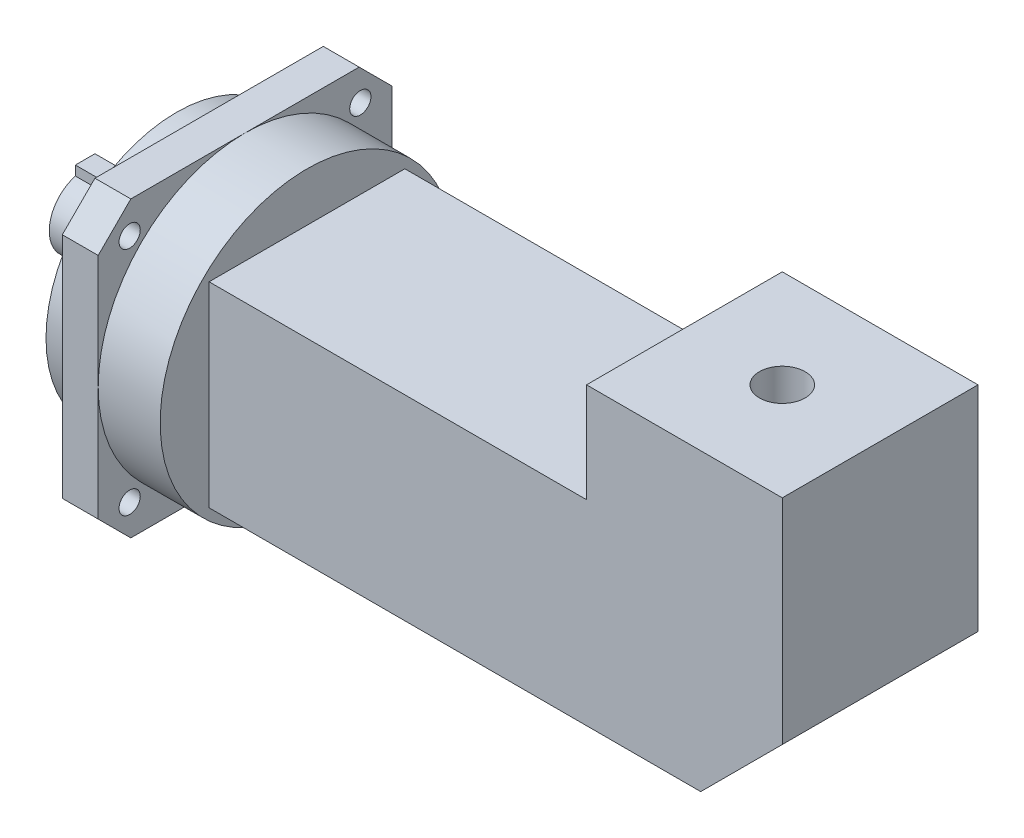
ISO-10303-21;
HEADER;
FILE_DESCRIPTION(('STEP AP214'),'2;1');
FILE_NAME('part.step','',(''),(''),'','','');
FILE_SCHEMA(('AUTOMOTIVE_DESIGN { 1 0 10303 214 1 1 1 1 }'));
ENDSEC;
DATA;
#1=APPLICATION_CONTEXT('core data for automotive mechanical design processes');
#2=APPLICATION_PROTOCOL_DEFINITION('international standard','automotive_design',2000,#1);
#3=PRODUCT_CONTEXT('',#1,'mechanical');
#4=PRODUCT('Part','Part','',(#3));
#5=PRODUCT_RELATED_PRODUCT_CATEGORY('part','',(#4));
#6=PRODUCT_DEFINITION_FORMATION('','',#4);
#7=PRODUCT_DEFINITION_CONTEXT('part definition',#1,'design');
#8=PRODUCT_DEFINITION('design','',#6,#7);
#9=PRODUCT_DEFINITION_SHAPE('','',#8);
#10=(LENGTH_UNIT() NAMED_UNIT(*) SI_UNIT(.MILLI.,.METRE.));
#11=(NAMED_UNIT(*) PLANE_ANGLE_UNIT() SI_UNIT($,.RADIAN.));
#12=(NAMED_UNIT(*) SI_UNIT($,.STERADIAN.) SOLID_ANGLE_UNIT());
#13=UNCERTAINTY_MEASURE_WITH_UNIT(LENGTH_MEASURE(1.E-05),#10,'distance_accuracy_value','');
#14=(GEOMETRIC_REPRESENTATION_CONTEXT(3) GLOBAL_UNCERTAINTY_ASSIGNED_CONTEXT((#13)) GLOBAL_UNIT_ASSIGNED_CONTEXT((#10,
#11,#12)) REPRESENTATION_CONTEXT('',''));
#15=CARTESIAN_POINT('',(0.,0.,0.));
#16=DIRECTION('',(0.,0.,1.));
#17=DIRECTION('',(1.,0.,0.));
#18=AXIS2_PLACEMENT_3D('',#15,#16,#17);
#19=CARTESIAN_POINT('',(30.,0.,0.));
#20=DIRECTION('',(1.,0.,0.));
#21=DIRECTION('',(0.,0.,-1.));
#22=AXIS2_PLACEMENT_3D('',#19,#20,#21);
#23=PLANE('',#22);
#24=CARTESIAN_POINT('',(30.,0.,0.));
#25=DIRECTION('',(1.,0.,0.));
#26=DIRECTION('',(0.,0.,-1.));
#27=AXIS2_PLACEMENT_3D('',#24,#25,#26);
#28=CIRCLE('',#27,45.);
#29=CARTESIAN_POINT('',(30.,0.,-45.));
#30=VERTEX_POINT('',#29);
#31=EDGE_CURVE('E359',#30,#30,#28,.T.);
#32=ORIENTED_EDGE('',*,*,#31,.T.);
#33=EDGE_LOOP('',(#32));
#34=FACE_BOUND('',#33,.T.);
#35=DIRECTION('',(0.,0.,1.));
#36=VECTOR('',#35,1.);
#37=CARTESIAN_POINT('',(30.,30.,30.));
#38=LINE('',#37,#36);
#39=CARTESIAN_POINT('',(30.,30.,-30.));
#40=VERTEX_POINT('',#39);
#41=CARTESIAN_POINT('',(30.,30.,30.));
#42=VERTEX_POINT('',#41);
#43=EDGE_CURVE('E347',#40,#42,#38,.T.);
#44=ORIENTED_EDGE('',*,*,#43,.F.);
#45=DIRECTION('',(0.,1.,0.));
#46=VECTOR('',#45,1.);
#47=CARTESIAN_POINT('',(30.,30.,-30.));
#48=LINE('',#47,#46);
#49=CARTESIAN_POINT('',(30.,-30.,-30.));
#50=VERTEX_POINT('',#49);
#51=EDGE_CURVE('E343',#50,#40,#48,.T.);
#52=ORIENTED_EDGE('',*,*,#51,.F.);
#53=DIRECTION('',(0.,0.,-1.));
#54=VECTOR('',#53,1.);
#55=CARTESIAN_POINT('',(30.,-30.,30.));
#56=LINE('',#55,#54);
#57=CARTESIAN_POINT('',(30.,-30.,30.));
#58=VERTEX_POINT('',#57);
#59=EDGE_CURVE('E355',#58,#50,#56,.T.);
#60=ORIENTED_EDGE('',*,*,#59,.F.);
#61=DIRECTION('',(0.,-1.,0.));
#62=VECTOR('',#61,1.);
#63=CARTESIAN_POINT('',(30.,30.,30.));
#64=LINE('',#63,#62);
#65=EDGE_CURVE('E351',#42,#58,#64,.T.);
#66=ORIENTED_EDGE('',*,*,#65,.F.);
#67=EDGE_LOOP('',(#44,#52,#60,#66));
#68=FACE_BOUND('',#67,.T.);
#69=ADVANCED_FACE('F43',(#34,#68),#23,.T.);
#70=CARTESIAN_POINT('',(30.,0.,0.));
#71=DIRECTION('',(-1.,0.,0.));
#72=DIRECTION('',(0.,0.,1.));
#73=AXIS2_PLACEMENT_3D('',#70,#71,#72);
#74=CYLINDRICAL_SURFACE('',#73,45.);
#75=CARTESIAN_POINT('',(11.,0.,0.));
#76=DIRECTION('',(1.,0.,0.));
#77=DIRECTION('',(0.,0.,-1.));
#78=AXIS2_PLACEMENT_3D('',#75,#76,#77);
#79=CIRCLE('',#78,45.);
#80=CARTESIAN_POINT('',(11.,-45.,0.));
#81=VERTEX_POINT('',#80);
#82=CARTESIAN_POINT('',(11.,0.,-45.));
#83=VERTEX_POINT('',#82);
#84=EDGE_CURVE('E48',#81,#83,#79,.T.);
#85=ORIENTED_EDGE('',*,*,#84,.T.);
#86=CARTESIAN_POINT('',(11.,45.,0.));
#87=VERTEX_POINT('',#86);
#88=EDGE_CURVE('E11',#83,#87,#79,.T.);
#89=ORIENTED_EDGE('',*,*,#88,.T.);
#90=CARTESIAN_POINT('',(11.,0.,45.));
#91=VERTEX_POINT('',#90);
#92=EDGE_CURVE('E54',#87,#91,#79,.T.);
#93=ORIENTED_EDGE('',*,*,#92,.T.);
#94=EDGE_CURVE('E432',#91,#81,#79,.T.);
#95=ORIENTED_EDGE('',*,*,#94,.T.);
#96=EDGE_LOOP('',(#85,#89,#93,#95));
#97=FACE_BOUND('',#96,.T.);
#98=ORIENTED_EDGE('',*,*,#31,.F.);
#99=EDGE_LOOP('',(#98));
#100=FACE_BOUND('',#99,.T.);
#101=ADVANCED_FACE('F437',(#97,#100),#74,.T.);
#102=CARTESIAN_POINT('',(205.7,0.,-30.));
#103=DIRECTION('',(0.,0.,-1.));
#104=DIRECTION('',(0.,1.,0.));
#105=AXIS2_PLACEMENT_3D('',#102,#103,#104);
#106=PLANE('',#105);
#107=DIRECTION('',(0.,-1.,0.));
#108=VECTOR('',#107,1.);
#109=CARTESIAN_POINT('',(205.7,0.,-30.));
#110=LINE('',#109,#108);
#111=CARTESIAN_POINT('',(205.7,60.5,-30.));
#112=VERTEX_POINT('',#111);
#113=CARTESIAN_POINT('',(205.7,-5.00000000000004,-30.));
#114=VERTEX_POINT('',#113);
#115=EDGE_CURVE('E323',#112,#114,#110,.T.);
#116=ORIENTED_EDGE('',*,*,#115,.T.);
#117=DIRECTION('',(-0.707106781186549,-0.707106781186546,0.));
#118=VECTOR('',#117,1.);
#119=CARTESIAN_POINT('',(208.2,-2.50000000000003,-30.));
#120=LINE('',#119,#118);
#121=CARTESIAN_POINT('',(180.7,-30.,-30.));
#122=VERTEX_POINT('',#121);
#123=EDGE_CURVE('E422',#114,#122,#120,.T.);
#124=ORIENTED_EDGE('',*,*,#123,.T.);
#125=DIRECTION('',(-1.,0.,0.));
#126=VECTOR('',#125,1.);
#127=CARTESIAN_POINT('',(205.7,-30.,-30.));
#128=LINE('',#127,#126);
#129=EDGE_CURVE('E331',#122,#50,#128,.T.);
#130=ORIENTED_EDGE('',*,*,#129,.T.);
#131=ORIENTED_EDGE('',*,*,#51,.T.);
#132=DIRECTION('',(-1.,0.,0.));
#133=VECTOR('',#132,1.);
#134=CARTESIAN_POINT('',(205.7,30.,-30.));
#135=LINE('',#134,#133);
#136=CARTESIAN_POINT('',(145.7,30.,-30.));
#137=VERTEX_POINT('',#136);
#138=EDGE_CURVE('E340',#137,#40,#135,.T.);
#139=ORIENTED_EDGE('',*,*,#138,.F.);
#140=DIRECTION('',(0.,-1.,0.));
#141=VECTOR('',#140,1.);
#142=CARTESIAN_POINT('',(145.7,60.5,-30.));
#143=LINE('',#142,#141);
#144=CARTESIAN_POINT('',(145.7,60.5,-30.));
#145=VERTEX_POINT('',#144);
#146=EDGE_CURVE('E316',#145,#137,#143,.T.);
#147=ORIENTED_EDGE('',*,*,#146,.F.);
#148=DIRECTION('',(-1.,0.,0.));
#149=VECTOR('',#148,1.);
#150=CARTESIAN_POINT('',(145.7,60.5,-30.));
#151=LINE('',#150,#149);
#152=EDGE_CURVE('E303',#112,#145,#151,.T.);
#153=ORIENTED_EDGE('',*,*,#152,.F.);
#154=EDGE_LOOP('',(#116,#124,#130,#131,#139,#147,#153));
#155=FACE_BOUND('',#154,.T.);
#156=ADVANCED_FACE('F499',(#155),#106,.T.);
#157=CARTESIAN_POINT('',(205.7,30.,0.));
#158=DIRECTION('',(0.,1.,0.));
#159=DIRECTION('',(0.,0.,1.));
#160=AXIS2_PLACEMENT_3D('',#157,#158,#159);
#161=PLANE('',#160);
#162=DIRECTION('',(-1.,0.,0.));
#163=VECTOR('',#162,1.);
#164=CARTESIAN_POINT('',(205.7,30.,30.));
#165=LINE('',#164,#163);
#166=CARTESIAN_POINT('',(145.7,30.,30.));
#167=VERTEX_POINT('',#166);
#168=EDGE_CURVE('E337',#167,#42,#165,.T.);
#169=ORIENTED_EDGE('',*,*,#168,.F.);
#170=DIRECTION('',(0.,0.,-1.));
#171=VECTOR('',#170,1.);
#172=CARTESIAN_POINT('',(145.7,30.,0.));
#173=LINE('',#172,#171);
#174=EDGE_CURVE('E319',#167,#137,#173,.T.);
#175=ORIENTED_EDGE('',*,*,#174,.T.);
#176=ORIENTED_EDGE('',*,*,#138,.T.);
#177=ORIENTED_EDGE('',*,*,#43,.T.);
#178=EDGE_LOOP('',(#169,#175,#176,#177));
#179=FACE_BOUND('',#178,.T.);
#180=ADVANCED_FACE('F784',(#179),#161,.T.);
#181=CARTESIAN_POINT('',(205.7,0.,30.));
#182=DIRECTION('',(0.,0.,-1.));
#183=DIRECTION('',(0.,1.,0.));
#184=AXIS2_PLACEMENT_3D('',#181,#182,#183);
#185=PLANE('',#184);
#186=DIRECTION('',(-1.,0.,0.));
#187=VECTOR('',#186,1.);
#188=CARTESIAN_POINT('',(205.7,-30.,30.));
#189=LINE('',#188,#187);
#190=CARTESIAN_POINT('',(180.7,-30.,30.));
#191=VERTEX_POINT('',#190);
#192=EDGE_CURVE('E334',#191,#58,#189,.T.);
#193=ORIENTED_EDGE('',*,*,#192,.F.);
#194=DIRECTION('',(0.707106781186549,0.707106781186546,0.));
#195=VECTOR('',#194,1.);
#196=CARTESIAN_POINT('',(205.7,-5.00000000000004,30.));
#197=LINE('',#196,#195);
#198=CARTESIAN_POINT('',(205.7,-5.00000000000004,30.));
#199=VERTEX_POINT('',#198);
#200=EDGE_CURVE('E426',#191,#199,#197,.T.);
#201=ORIENTED_EDGE('',*,*,#200,.T.);
#202=DIRECTION('',(0.,-1.,0.));
#203=VECTOR('',#202,1.);
#204=CARTESIAN_POINT('',(205.7,0.,30.));
#205=LINE('',#204,#203);
#206=CARTESIAN_POINT('',(205.7,60.5,30.));
#207=VERTEX_POINT('',#206);
#208=EDGE_CURVE('E327',#207,#199,#205,.T.);
#209=ORIENTED_EDGE('',*,*,#208,.F.);
#210=DIRECTION('',(1.,0.,0.));
#211=VECTOR('',#210,1.);
#212=CARTESIAN_POINT('',(145.7,60.5,30.));
#213=LINE('',#212,#211);
#214=CARTESIAN_POINT('',(145.7,60.5,30.));
#215=VERTEX_POINT('',#214);
#216=EDGE_CURVE('E309',#215,#207,#213,.T.);
#217=ORIENTED_EDGE('',*,*,#216,.F.);
#218=DIRECTION('',(0.,-1.,0.));
#219=VECTOR('',#218,1.);
#220=CARTESIAN_POINT('',(145.7,60.5,30.));
#221=LINE('',#220,#219);
#222=EDGE_CURVE('E313',#215,#167,#221,.T.);
#223=ORIENTED_EDGE('',*,*,#222,.T.);
#224=ORIENTED_EDGE('',*,*,#168,.T.);
#225=ORIENTED_EDGE('',*,*,#65,.T.);
#226=EDGE_LOOP('',(#193,#201,#209,#217,#223,#224,#225));
#227=FACE_BOUND('',#226,.T.);
#228=ADVANCED_FACE('F775',(#227),#185,.F.);
#229=CARTESIAN_POINT('',(205.7,-30.,0.));
#230=DIRECTION('',(0.,1.,0.));
#231=DIRECTION('',(0.,0.,1.));
#232=AXIS2_PLACEMENT_3D('',#229,#230,#231);
#233=PLANE('',#232);
#234=ORIENTED_EDGE('',*,*,#129,.F.);
#235=DIRECTION('',(0.,0.,1.));
#236=VECTOR('',#235,1.);
#237=CARTESIAN_POINT('',(180.7,-30.,30.));
#238=LINE('',#237,#236);
#239=EDGE_CURVE('E69',#122,#191,#238,.T.);
#240=ORIENTED_EDGE('',*,*,#239,.T.);
#241=ORIENTED_EDGE('',*,*,#192,.T.);
#242=ORIENTED_EDGE('',*,*,#59,.T.);
#243=EDGE_LOOP('',(#234,#240,#241,#242));
#244=FACE_BOUND('',#243,.T.);
#245=ADVANCED_FACE('F761',(#244),#233,.F.);
#246=CARTESIAN_POINT('',(205.7,0.,0.));
#247=DIRECTION('',(1.,0.,0.));
#248=DIRECTION('',(0.,0.,-1.));
#249=AXIS2_PLACEMENT_3D('',#246,#247,#248);
#250=PLANE('',#249);
#251=ORIENTED_EDGE('',*,*,#208,.T.);
#252=DIRECTION('',(0.,0.,-1.));
#253=VECTOR('',#252,1.);
#254=CARTESIAN_POINT('',(205.7,-5.00000000000004,-30.));
#255=LINE('',#254,#253);
#256=EDGE_CURVE('E418',#199,#114,#255,.T.);
#257=ORIENTED_EDGE('',*,*,#256,.T.);
#258=ORIENTED_EDGE('',*,*,#115,.F.);
#259=DIRECTION('',(0.,0.,-1.));
#260=VECTOR('',#259,1.);
#261=CARTESIAN_POINT('',(205.7,60.5,-30.));
#262=LINE('',#261,#260);
#263=EDGE_CURVE('E299',#207,#112,#262,.T.);
#264=ORIENTED_EDGE('',*,*,#263,.F.);
#265=EDGE_LOOP('',(#251,#257,#258,#264));
#266=FACE_BOUND('',#265,.T.);
#267=ADVANCED_FACE('F755',(#266),#250,.T.);
#268=CARTESIAN_POINT('',(0.,60.5,0.));
#269=DIRECTION('',(0.,1.,0.));
#270=DIRECTION('',(0.,0.,1.));
#271=AXIS2_PLACEMENT_3D('',#268,#269,#270);
#272=PLANE('',#271);
#273=ORIENTED_EDGE('',*,*,#263,.T.);
#274=ORIENTED_EDGE('',*,*,#152,.T.);
#275=DIRECTION('',(0.,0.,1.));
#276=VECTOR('',#275,1.);
#277=CARTESIAN_POINT('',(145.7,60.5,-30.));
#278=LINE('',#277,#276);
#279=EDGE_CURVE('E306',#145,#215,#278,.T.);
#280=ORIENTED_EDGE('',*,*,#279,.T.);
#281=ORIENTED_EDGE('',*,*,#216,.T.);
#282=EDGE_LOOP('',(#273,#274,#280,#281));
#283=FACE_BOUND('',#282,.T.);
#284=CARTESIAN_POINT('',(175.7,60.5,0.));
#285=DIRECTION('',(0.,1.,0.));
#286=DIRECTION('',(0.,0.,1.));
#287=AXIS2_PLACEMENT_3D('',#284,#285,#286);
#288=CIRCLE('',#287,7.00000000000001);
#289=CARTESIAN_POINT('',(175.7,60.5,7.));
#290=VERTEX_POINT('',#289);
#291=EDGE_CURVE('E201',#290,#290,#288,.T.);
#292=ORIENTED_EDGE('',*,*,#291,.F.);
#293=EDGE_LOOP('',(#292));
#294=FACE_BOUND('',#293,.T.);
#295=ADVANCED_FACE('F760',(#283,#294),#272,.T.);
#296=CARTESIAN_POINT('',(145.7,60.5,-30.));
#297=DIRECTION('',(1.,0.,0.));
#298=DIRECTION('',(0.,0.,-1.));
#299=AXIS2_PLACEMENT_3D('',#296,#297,#298);
#300=PLANE('',#299);
#301=ORIENTED_EDGE('',*,*,#174,.F.);
#302=ORIENTED_EDGE('',*,*,#222,.F.);
#303=ORIENTED_EDGE('',*,*,#279,.F.);
#304=ORIENTED_EDGE('',*,*,#146,.T.);
#305=EDGE_LOOP('',(#301,#302,#303,#304));
#306=FACE_BOUND('',#305,.T.);
#307=ADVANCED_FACE('F808',(#306),#300,.F.);
#308=CARTESIAN_POINT('',(175.7,60.5,0.));
#309=DIRECTION('',(0.,-1.,0.));
#310=DIRECTION('',(0.,0.,-1.));
#311=AXIS2_PLACEMENT_3D('',#308,#309,#310);
#312=CYLINDRICAL_SURFACE('',#311,7.00000000000001);
#313=CARTESIAN_POINT('',(175.7,30.,0.));
#314=DIRECTION('',(0.,1.,0.));
#315=DIRECTION('',(0.,0.,1.));
#316=AXIS2_PLACEMENT_3D('',#313,#314,#315);
#317=CIRCLE('',#316,7.00000000000001);
#318=CARTESIAN_POINT('',(175.7,30.,7.));
#319=VERTEX_POINT('',#318);
#320=EDGE_CURVE('E414',#319,#319,#317,.F.);
#321=ORIENTED_EDGE('',*,*,#320,.T.);
#322=EDGE_LOOP('',(#321));
#323=FACE_BOUND('',#322,.T.);
#324=ORIENTED_EDGE('',*,*,#291,.T.);
#325=EDGE_LOOP('',(#324));
#326=FACE_BOUND('',#325,.T.);
#327=ADVANCED_FACE('F800',(#323,#326),#312,.F.);
#328=ORIENTED_EDGE('',*,*,#320,.F.);
#329=EDGE_LOOP('',(#328));
#330=FACE_BOUND('',#329,.T.);
#331=ADVANCED_FACE('F748',(#330),#161,.T.);
#332=CARTESIAN_POINT('',(205.7,-5.00000000000004,0.));
#333=DIRECTION('',(0.707106781186546,-0.707106781186549,0.));
#334=DIRECTION('',(0.,0.,1.));
#335=AXIS2_PLACEMENT_3D('',#332,#333,#334);
#336=PLANE('',#335);
#337=ORIENTED_EDGE('',*,*,#200,.F.);
#338=ORIENTED_EDGE('',*,*,#239,.F.);
#339=ORIENTED_EDGE('',*,*,#123,.F.);
#340=ORIENTED_EDGE('',*,*,#256,.F.);
#341=EDGE_LOOP('',(#337,#338,#339,#340));
#342=FACE_BOUND('',#341,.T.);
#343=ADVANCED_FACE('F46',(#342),#336,.T.);
#344=CARTESIAN_POINT('',(11.,45.,0.));
#345=DIRECTION('',(0.,1.,0.));
#346=DIRECTION('',(0.,0.,1.));
#347=AXIS2_PLACEMENT_3D('',#344,#345,#346);
#348=PLANE('',#347);
#349=DIRECTION('',(0.,0.,-1.));
#350=VECTOR('',#349,1.);
#351=CARTESIAN_POINT('',(0.,45.,0.));
#352=LINE('',#351,#350);
#353=CARTESIAN_POINT('',(0.,45.,35.));
#354=VERTEX_POINT('',#353);
#355=CARTESIAN_POINT('',(0.,45.,-35.));
#356=VERTEX_POINT('',#355);
#357=EDGE_CURVE('E195',#354,#356,#352,.T.);
#358=ORIENTED_EDGE('',*,*,#357,.F.);
#359=DIRECTION('',(-1.,0.,0.));
#360=VECTOR('',#359,1.);
#361=CARTESIAN_POINT('',(11.,45.,35.));
#362=LINE('',#361,#360);
#363=CARTESIAN_POINT('',(11.,45.,35.));
#364=VERTEX_POINT('',#363);
#365=EDGE_CURVE('E190',#364,#354,#362,.T.);
#366=ORIENTED_EDGE('',*,*,#365,.F.);
#367=DIRECTION('',(0.,0.,-1.));
#368=VECTOR('',#367,1.);
#369=CARTESIAN_POINT('',(11.,45.,0.));
#370=LINE('',#369,#368);
#371=EDGE_CURVE('E193',#364,#87,#370,.T.);
#372=ORIENTED_EDGE('',*,*,#371,.T.);
#373=CARTESIAN_POINT('',(11.,45.,-35.));
#374=VERTEX_POINT('',#373);
#375=EDGE_CURVE('E212',#87,#374,#370,.T.);
#376=ORIENTED_EDGE('',*,*,#375,.T.);
#377=DIRECTION('',(-1.,0.,0.));
#378=VECTOR('',#377,1.);
#379=CARTESIAN_POINT('',(11.,45.,-35.));
#380=LINE('',#379,#378);
#381=EDGE_CURVE('E245',#374,#356,#380,.T.);
#382=ORIENTED_EDGE('',*,*,#381,.T.);
#383=EDGE_LOOP('',(#358,#366,#372,#376,#382));
#384=FACE_BOUND('',#383,.T.);
#385=ADVANCED_FACE('F192',(#384),#348,.T.);
#386=CARTESIAN_POINT('',(11.,0.,45.));
#387=DIRECTION('',(0.,0.,-1.));
#388=DIRECTION('',(0.,1.,0.));
#389=AXIS2_PLACEMENT_3D('',#386,#387,#388);
#390=PLANE('',#389);
#391=DIRECTION('',(0.,-1.,0.));
#392=VECTOR('',#391,1.);
#393=CARTESIAN_POINT('',(11.,0.,45.));
#394=LINE('',#393,#392);
#395=CARTESIAN_POINT('',(11.,-35.,45.));
#396=VERTEX_POINT('',#395);
#397=EDGE_CURVE('E218',#91,#396,#394,.T.);
#398=ORIENTED_EDGE('',*,*,#397,.F.);
#399=CARTESIAN_POINT('',(11.,35.,45.));
#400=VERTEX_POINT('',#399);
#401=EDGE_CURVE('E221',#400,#91,#394,.T.);
#402=ORIENTED_EDGE('',*,*,#401,.F.);
#403=DIRECTION('',(-1.,0.,0.));
#404=VECTOR('',#403,1.);
#405=CARTESIAN_POINT('',(11.,35.,45.));
#406=LINE('',#405,#404);
#407=CARTESIAN_POINT('',(0.,35.,45.));
#408=VERTEX_POINT('',#407);
#409=EDGE_CURVE('E202',#400,#408,#406,.T.);
#410=ORIENTED_EDGE('',*,*,#409,.T.);
#411=DIRECTION('',(0.,-1.,0.));
#412=VECTOR('',#411,1.);
#413=CARTESIAN_POINT('',(0.,0.,45.));
#414=LINE('',#413,#412);
#415=CARTESIAN_POINT('',(0.,-35.,45.));
#416=VERTEX_POINT('',#415);
#417=EDGE_CURVE('E252',#408,#416,#414,.T.);
#418=ORIENTED_EDGE('',*,*,#417,.T.);
#419=DIRECTION('',(-1.,0.,0.));
#420=VECTOR('',#419,1.);
#421=CARTESIAN_POINT('',(11.,-35.,45.));
#422=LINE('',#421,#420);
#423=EDGE_CURVE('E290',#396,#416,#422,.T.);
#424=ORIENTED_EDGE('',*,*,#423,.F.);
#425=EDGE_LOOP('',(#398,#402,#410,#418,#424));
#426=FACE_BOUND('',#425,.T.);
#427=ADVANCED_FACE('F556',(#426),#390,.F.);
#428=CARTESIAN_POINT('',(11.,-45.,0.));
#429=DIRECTION('',(0.,1.,0.));
#430=DIRECTION('',(0.,0.,1.));
#431=AXIS2_PLACEMENT_3D('',#428,#429,#430);
#432=PLANE('',#431);
#433=DIRECTION('',(0.,0.,-1.));
#434=VECTOR('',#433,1.);
#435=CARTESIAN_POINT('',(11.,-45.,0.));
#436=LINE('',#435,#434);
#437=CARTESIAN_POINT('',(11.,-45.,-35.));
#438=VERTEX_POINT('',#437);
#439=EDGE_CURVE('E229',#81,#438,#436,.T.);
#440=ORIENTED_EDGE('',*,*,#439,.F.);
#441=CARTESIAN_POINT('',(11.,-45.,35.));
#442=VERTEX_POINT('',#441);
#443=EDGE_CURVE('E230',#442,#81,#436,.T.);
#444=ORIENTED_EDGE('',*,*,#443,.F.);
#445=DIRECTION('',(-1.,0.,0.));
#446=VECTOR('',#445,1.);
#447=CARTESIAN_POINT('',(11.,-45.,35.));
#448=LINE('',#447,#446);
#449=CARTESIAN_POINT('',(0.,-45.,35.));
#450=VERTEX_POINT('',#449);
#451=EDGE_CURVE('E286',#442,#450,#448,.T.);
#452=ORIENTED_EDGE('',*,*,#451,.T.);
#453=DIRECTION('',(0.,0.,-1.));
#454=VECTOR('',#453,1.);
#455=CARTESIAN_POINT('',(0.,-45.,0.));
#456=LINE('',#455,#454);
#457=CARTESIAN_POINT('',(0.,-45.,-35.));
#458=VERTEX_POINT('',#457);
#459=EDGE_CURVE('E259',#450,#458,#456,.T.);
#460=ORIENTED_EDGE('',*,*,#459,.T.);
#461=DIRECTION('',(-1.,0.,0.));
#462=VECTOR('',#461,1.);
#463=CARTESIAN_POINT('',(11.,-45.,-35.));
#464=LINE('',#463,#462);
#465=EDGE_CURVE('E282',#438,#458,#464,.T.);
#466=ORIENTED_EDGE('',*,*,#465,.F.);
#467=EDGE_LOOP('',(#440,#444,#452,#460,#466));
#468=FACE_BOUND('',#467,.T.);
#469=ADVANCED_FACE('F564',(#468),#432,.F.);
#470=CARTESIAN_POINT('',(11.,0.,-45.));
#471=DIRECTION('',(0.,0.,-1.));
#472=DIRECTION('',(0.,1.,0.));
#473=AXIS2_PLACEMENT_3D('',#470,#471,#472);
#474=PLANE('',#473);
#475=DIRECTION('',(-1.,0.,0.));
#476=VECTOR('',#475,1.);
#477=CARTESIAN_POINT('',(11.,-35.,-45.));
#478=LINE('',#477,#476);
#479=CARTESIAN_POINT('',(11.,-35.,-45.));
#480=VERTEX_POINT('',#479);
#481=CARTESIAN_POINT('',(0.,-35.,-45.));
#482=VERTEX_POINT('',#481);
#483=EDGE_CURVE('E278',#480,#482,#478,.T.);
#484=ORIENTED_EDGE('',*,*,#483,.T.);
#485=DIRECTION('',(0.,-1.,0.));
#486=VECTOR('',#485,1.);
#487=CARTESIAN_POINT('',(0.,0.,-45.));
#488=LINE('',#487,#486);
#489=CARTESIAN_POINT('',(0.,35.,-45.));
#490=VERTEX_POINT('',#489);
#491=EDGE_CURVE('E266',#490,#482,#488,.T.);
#492=ORIENTED_EDGE('',*,*,#491,.F.);
#493=DIRECTION('',(-1.,0.,0.));
#494=VECTOR('',#493,1.);
#495=CARTESIAN_POINT('',(11.,35.,-45.));
#496=LINE('',#495,#494);
#497=CARTESIAN_POINT('',(11.,35.,-45.));
#498=VERTEX_POINT('',#497);
#499=EDGE_CURVE('E275',#498,#490,#496,.T.);
#500=ORIENTED_EDGE('',*,*,#499,.F.);
#501=DIRECTION('',(0.,-1.,0.));
#502=VECTOR('',#501,1.);
#503=CARTESIAN_POINT('',(11.,0.,-45.));
#504=LINE('',#503,#502);
#505=EDGE_CURVE('E61',#498,#83,#504,.T.);
#506=ORIENTED_EDGE('',*,*,#505,.T.);
#507=EDGE_CURVE('E238',#83,#480,#504,.T.);
#508=ORIENTED_EDGE('',*,*,#507,.T.);
#509=EDGE_LOOP('',(#484,#492,#500,#506,#508));
#510=FACE_BOUND('',#509,.T.);
#511=ADVANCED_FACE('F571',(#510),#474,.T.);
#512=CARTESIAN_POINT('',(11.,0.,0.));
#513=DIRECTION('',(1.,0.,0.));
#514=DIRECTION('',(0.,0.,-1.));
#515=AXIS2_PLACEMENT_3D('',#512,#513,#514);
#516=PLANE('',#515);
#517=CARTESIAN_POINT('',(11.,35.3553390593274,-35.3553390593273));
#518=DIRECTION('',(1.,0.,0.));
#519=DIRECTION('',(0.,0.,-1.));
#520=AXIS2_PLACEMENT_3D('',#517,#518,#519);
#521=CIRCLE('',#520,3.25);
#522=CARTESIAN_POINT('',(11.,35.3553390593274,-38.6053390593273));
#523=VERTEX_POINT('',#522);
#524=EDGE_CURVE('E455',#523,#523,#521,.F.);
#525=ORIENTED_EDGE('',*,*,#524,.T.);
#526=EDGE_LOOP('',(#525));
#527=FACE_BOUND('',#526,.T.);
#528=ORIENTED_EDGE('',*,*,#88,.F.);
#529=ORIENTED_EDGE('',*,*,#505,.F.);
#530=DIRECTION('',(0.,-0.707106781186547,-0.707106781186548));
#531=VECTOR('',#530,1.);
#532=CARTESIAN_POINT('',(11.,40.,-40.));
#533=LINE('',#532,#531);
#534=EDGE_CURVE('E241',#374,#498,#533,.T.);
#535=ORIENTED_EDGE('',*,*,#534,.F.);
#536=ORIENTED_EDGE('',*,*,#375,.F.);
#537=EDGE_LOOP('',(#528,#529,#535,#536));
#538=FACE_BOUND('',#537,.T.);
#539=ADVANCED_FACE('F441',(#527,#538),#516,.T.);
#540=CARTESIAN_POINT('',(11.,35.3553390593273,35.3553390593274));
#541=DIRECTION('',(1.,0.,0.));
#542=DIRECTION('',(0.,0.,-1.));
#543=AXIS2_PLACEMENT_3D('',#540,#541,#542);
#544=CIRCLE('',#543,3.25);
#545=CARTESIAN_POINT('',(11.,35.3553390593273,32.1053390593274));
#546=VERTEX_POINT('',#545);
#547=EDGE_CURVE('E249',#546,#546,#544,.F.);
#548=ORIENTED_EDGE('',*,*,#547,.T.);
#549=EDGE_LOOP('',(#548));
#550=FACE_BOUND('',#549,.T.);
#551=ORIENTED_EDGE('',*,*,#92,.F.);
#552=ORIENTED_EDGE('',*,*,#371,.F.);
#553=DIRECTION('',(0.,0.707106781186547,-0.707106781186548));
#554=VECTOR('',#553,1.);
#555=CARTESIAN_POINT('',(11.,40.,40.));
#556=LINE('',#555,#554);
#557=EDGE_CURVE('E208',#400,#364,#556,.T.);
#558=ORIENTED_EDGE('',*,*,#557,.F.);
#559=ORIENTED_EDGE('',*,*,#401,.T.);
#560=EDGE_LOOP('',(#551,#552,#558,#559));
#561=FACE_BOUND('',#560,.T.);
#562=ADVANCED_FACE('F206',(#550,#561),#516,.T.);
#563=CARTESIAN_POINT('',(11.,-35.3553390593274,35.3553390593273));
#564=DIRECTION('',(1.,0.,0.));
#565=DIRECTION('',(0.,0.,-1.));
#566=AXIS2_PLACEMENT_3D('',#563,#564,#565);
#567=CIRCLE('',#566,3.25);
#568=CARTESIAN_POINT('',(11.,-35.3553390593274,32.1053390593273));
#569=VERTEX_POINT('',#568);
#570=EDGE_CURVE('E448',#569,#569,#567,.F.);
#571=ORIENTED_EDGE('',*,*,#570,.T.);
#572=EDGE_LOOP('',(#571));
#573=FACE_BOUND('',#572,.T.);
#574=ORIENTED_EDGE('',*,*,#94,.F.);
#575=ORIENTED_EDGE('',*,*,#397,.T.);
#576=DIRECTION('',(0.,-0.707106781186548,-0.707106781186547));
#577=VECTOR('',#576,1.);
#578=CARTESIAN_POINT('',(11.,-40.,40.));
#579=LINE('',#578,#577);
#580=EDGE_CURVE('E226',#396,#442,#579,.T.);
#581=ORIENTED_EDGE('',*,*,#580,.T.);
#582=ORIENTED_EDGE('',*,*,#443,.T.);
#583=EDGE_LOOP('',(#574,#575,#581,#582));
#584=FACE_BOUND('',#583,.T.);
#585=ADVANCED_FACE('F559',(#573,#584),#516,.T.);
#586=CARTESIAN_POINT('',(11.,40.,40.));
#587=DIRECTION('',(0.,0.707106781186548,0.707106781186547));
#588=DIRECTION('',(0.,-0.707106781186547,0.707106781186548));
#589=AXIS2_PLACEMENT_3D('',#586,#587,#588);
#590=PLANE('',#589);
#591=DIRECTION('',(0.,0.707106781186547,-0.707106781186548));
#592=VECTOR('',#591,1.);
#593=CARTESIAN_POINT('',(0.,40.,40.));
#594=LINE('',#593,#592);
#595=EDGE_CURVE('E248',#408,#354,#594,.T.);
#596=ORIENTED_EDGE('',*,*,#595,.F.);
#597=ORIENTED_EDGE('',*,*,#409,.F.);
#598=ORIENTED_EDGE('',*,*,#557,.T.);
#599=ORIENTED_EDGE('',*,*,#365,.T.);
#600=EDGE_LOOP('',(#596,#597,#598,#599));
#601=FACE_BOUND('',#600,.T.);
#602=ADVANCED_FACE('F214',(#601),#590,.T.);
#603=CARTESIAN_POINT('',(11.,-40.,40.));
#604=DIRECTION('',(0.,0.707106781186547,-0.707106781186548));
#605=DIRECTION('',(0.,0.707106781186548,0.707106781186547));
#606=AXIS2_PLACEMENT_3D('',#603,#604,#605);
#607=PLANE('',#606);
#608=DIRECTION('',(0.,-0.707106781186548,-0.707106781186547));
#609=VECTOR('',#608,1.);
#610=CARTESIAN_POINT('',(0.,-40.,40.));
#611=LINE('',#610,#609);
#612=EDGE_CURVE('E255',#416,#450,#611,.T.);
#613=ORIENTED_EDGE('',*,*,#612,.T.);
#614=ORIENTED_EDGE('',*,*,#451,.F.);
#615=ORIENTED_EDGE('',*,*,#580,.F.);
#616=ORIENTED_EDGE('',*,*,#423,.T.);
#617=EDGE_LOOP('',(#613,#614,#615,#616));
#618=FACE_BOUND('',#617,.T.);
#619=ADVANCED_FACE('F593',(#618),#607,.F.);
#620=CARTESIAN_POINT('',(11.,-40.,-40.));
#621=DIRECTION('',(0.,-0.707106781186547,-0.707106781186548));
#622=DIRECTION('',(0.,0.707106781186548,-0.707106781186547));
#623=AXIS2_PLACEMENT_3D('',#620,#621,#622);
#624=PLANE('',#623);
#625=DIRECTION('',(0.,-0.707106781186548,0.707106781186547));
#626=VECTOR('',#625,1.);
#627=CARTESIAN_POINT('',(0.,-40.,-40.));
#628=LINE('',#627,#626);
#629=EDGE_CURVE('E262',#482,#458,#628,.T.);
#630=ORIENTED_EDGE('',*,*,#629,.F.);
#631=ORIENTED_EDGE('',*,*,#483,.F.);
#632=DIRECTION('',(0.,-0.707106781186548,0.707106781186547));
#633=VECTOR('',#632,1.);
#634=CARTESIAN_POINT('',(11.,-40.,-40.));
#635=LINE('',#634,#633);
#636=EDGE_CURVE('E234',#480,#438,#635,.T.);
#637=ORIENTED_EDGE('',*,*,#636,.T.);
#638=ORIENTED_EDGE('',*,*,#465,.T.);
#639=EDGE_LOOP('',(#630,#631,#637,#638));
#640=FACE_BOUND('',#639,.T.);
#641=ADVANCED_FACE('F575',(#640),#624,.T.);
#642=CARTESIAN_POINT('',(11.,40.,-40.));
#643=DIRECTION('',(0.,0.707106781186548,-0.707106781186547));
#644=DIRECTION('',(0.,0.707106781186547,0.707106781186548));
#645=AXIS2_PLACEMENT_3D('',#642,#643,#644);
#646=PLANE('',#645);
#647=DIRECTION('',(0.,-0.707106781186547,-0.707106781186548));
#648=VECTOR('',#647,1.);
#649=CARTESIAN_POINT('',(0.,40.,-40.));
#650=LINE('',#649,#648);
#651=EDGE_CURVE('E269',#356,#490,#650,.T.);
#652=ORIENTED_EDGE('',*,*,#651,.F.);
#653=ORIENTED_EDGE('',*,*,#381,.F.);
#654=ORIENTED_EDGE('',*,*,#534,.T.);
#655=ORIENTED_EDGE('',*,*,#499,.T.);
#656=EDGE_LOOP('',(#652,#653,#654,#655));
#657=FACE_BOUND('',#656,.T.);
#658=ADVANCED_FACE('F577',(#657),#646,.T.);
#659=CARTESIAN_POINT('',(11.,-35.3553390593273,-35.3553390593274));
#660=DIRECTION('',(1.,0.,0.));
#661=DIRECTION('',(0.,0.,-1.));
#662=AXIS2_PLACEMENT_3D('',#659,#660,#661);
#663=CIRCLE('',#662,3.25);
#664=CARTESIAN_POINT('',(11.,-35.3553390593273,-38.6053390593274));
#665=VERTEX_POINT('',#664);
#666=EDGE_CURVE('E451',#665,#665,#663,.F.);
#667=ORIENTED_EDGE('',*,*,#666,.T.);
#668=EDGE_LOOP('',(#667));
#669=FACE_BOUND('',#668,.T.);
#670=ORIENTED_EDGE('',*,*,#84,.F.);
#671=ORIENTED_EDGE('',*,*,#439,.T.);
#672=ORIENTED_EDGE('',*,*,#636,.F.);
#673=ORIENTED_EDGE('',*,*,#507,.F.);
#674=EDGE_LOOP('',(#670,#671,#672,#673));
#675=FACE_BOUND('',#674,.T.);
#676=ADVANCED_FACE('F521',(#669,#675),#516,.T.);
#677=CARTESIAN_POINT('',(-38.,0.,0.));
#678=DIRECTION('',(1.,0.,0.));
#679=DIRECTION('',(0.,0.,-1.));
#680=AXIS2_PLACEMENT_3D('',#677,#678,#679);
#681=PLANE('',#680);
#682=CARTESIAN_POINT('',(-38.,0.,0.));
#683=DIRECTION('',(1.,0.,0.));
#684=DIRECTION('',(0.,0.,-1.));
#685=AXIS2_PLACEMENT_3D('',#682,#683,#684);
#686=CIRCLE('',#685,11.);
#687=CARTESIAN_POINT('',(-38.,10.5830052442584,3.));
#688=VERTEX_POINT('',#687);
#689=CARTESIAN_POINT('',(-38.,10.5830052442584,-3.));
#690=VERTEX_POINT('',#689);
#691=EDGE_CURVE('E383',#688,#690,#686,.T.);
#692=ORIENTED_EDGE('',*,*,#691,.F.);
#693=DIRECTION('',(0.,-1.,0.));
#694=VECTOR('',#693,1.);
#695=CARTESIAN_POINT('',(-38.,0.,3.));
#696=LINE('',#695,#694);
#697=CARTESIAN_POINT('',(-38.,13.5,3.));
#698=VERTEX_POINT('',#697);
#699=EDGE_CURVE('E398',#698,#688,#696,.T.);
#700=ORIENTED_EDGE('',*,*,#699,.F.);
#701=DIRECTION('',(0.,0.,1.));
#702=VECTOR('',#701,1.);
#703=CARTESIAN_POINT('',(-38.,13.5,0.));
#704=LINE('',#703,#702);
#705=CARTESIAN_POINT('',(-38.,13.5,-3.));
#706=VERTEX_POINT('',#705);
#707=EDGE_CURVE('E394',#706,#698,#704,.T.);
#708=ORIENTED_EDGE('',*,*,#707,.F.);
#709=DIRECTION('',(0.,-1.,0.));
#710=VECTOR('',#709,1.);
#711=CARTESIAN_POINT('',(-38.,0.,-3.));
#712=LINE('',#711,#710);
#713=EDGE_CURVE('E390',#706,#690,#712,.T.);
#714=ORIENTED_EDGE('',*,*,#713,.T.);
#715=EDGE_LOOP('',(#692,#700,#708,#714));
#716=FACE_BOUND('',#715,.T.);
#717=ADVANCED_FACE('F517',(#716),#681,.F.);
#718=CARTESIAN_POINT('',(10.,0.,3.));
#719=DIRECTION('',(0.,0.,-1.));
#720=DIRECTION('',(-1.,0.,0.));
#721=AXIS2_PLACEMENT_3D('',#718,#719,#720);
#722=PLANE('',#721);
#723=DIRECTION('',(0.,-1.,0.));
#724=VECTOR('',#723,1.);
#725=CARTESIAN_POINT('',(-10.,0.,3.));
#726=LINE('',#725,#724);
#727=CARTESIAN_POINT('',(-10.,13.5,3.));
#728=VERTEX_POINT('',#727);
#729=CARTESIAN_POINT('',(-10.,10.5830052442584,3.));
#730=VERTEX_POINT('',#729);
#731=EDGE_CURVE('E368',#728,#730,#726,.T.);
#732=ORIENTED_EDGE('',*,*,#731,.F.);
#733=DIRECTION('',(-1.,0.,0.));
#734=VECTOR('',#733,1.);
#735=CARTESIAN_POINT('',(10.,13.5,3.));
#736=LINE('',#735,#734);
#737=EDGE_CURVE('E405',#728,#698,#736,.T.);
#738=ORIENTED_EDGE('',*,*,#737,.T.);
#739=ORIENTED_EDGE('',*,*,#699,.T.);
#740=DIRECTION('',(-1.,0.,0.));
#741=VECTOR('',#740,1.);
#742=CARTESIAN_POINT('',(10.,10.5830052442584,3.));
#743=LINE('',#742,#741);
#744=EDGE_CURVE('E402',#730,#688,#743,.T.);
#745=ORIENTED_EDGE('',*,*,#744,.F.);
#746=EDGE_LOOP('',(#732,#738,#739,#745));
#747=FACE_BOUND('',#746,.T.);
#748=ADVANCED_FACE('F520',(#747),#722,.F.);
#749=CARTESIAN_POINT('',(10.,13.5,0.));
#750=DIRECTION('',(0.,-1.,0.));
#751=DIRECTION('',(0.,0.,-1.));
#752=AXIS2_PLACEMENT_3D('',#749,#750,#751);
#753=PLANE('',#752);
#754=DIRECTION('',(0.,0.,1.));
#755=VECTOR('',#754,1.);
#756=CARTESIAN_POINT('',(-10.,13.5,0.));
#757=LINE('',#756,#755);
#758=CARTESIAN_POINT('',(-10.,13.5,-3.));
#759=VERTEX_POINT('',#758);
#760=EDGE_CURVE('E372',#759,#728,#757,.T.);
#761=ORIENTED_EDGE('',*,*,#760,.F.);
#762=DIRECTION('',(-1.,0.,0.));
#763=VECTOR('',#762,1.);
#764=CARTESIAN_POINT('',(10.,13.5,-3.));
#765=LINE('',#764,#763);
#766=EDGE_CURVE('E408',#759,#706,#765,.T.);
#767=ORIENTED_EDGE('',*,*,#766,.T.);
#768=ORIENTED_EDGE('',*,*,#707,.T.);
#769=ORIENTED_EDGE('',*,*,#737,.F.);
#770=EDGE_LOOP('',(#761,#767,#768,#769));
#771=FACE_BOUND('',#770,.T.);
#772=ADVANCED_FACE('F525',(#771),#753,.F.);
#773=CARTESIAN_POINT('',(10.,0.,-3.));
#774=DIRECTION('',(0.,0.,-1.));
#775=DIRECTION('',(0.,1.,0.));
#776=AXIS2_PLACEMENT_3D('',#773,#774,#775);
#777=PLANE('',#776);
#778=ORIENTED_EDGE('',*,*,#766,.F.);
#779=DIRECTION('',(0.,-1.,0.));
#780=VECTOR('',#779,1.);
#781=CARTESIAN_POINT('',(-10.,0.,-3.));
#782=LINE('',#781,#780);
#783=CARTESIAN_POINT('',(-10.,10.5830052442584,-3.));
#784=VERTEX_POINT('',#783);
#785=EDGE_CURVE('E376',#759,#784,#782,.T.);
#786=ORIENTED_EDGE('',*,*,#785,.T.);
#787=DIRECTION('',(-1.,0.,0.));
#788=VECTOR('',#787,1.);
#789=CARTESIAN_POINT('',(10.,10.5830052442584,-3.));
#790=LINE('',#789,#788);
#791=EDGE_CURVE('E411',#784,#690,#790,.T.);
#792=ORIENTED_EDGE('',*,*,#791,.T.);
#793=ORIENTED_EDGE('',*,*,#713,.F.);
#794=EDGE_LOOP('',(#778,#786,#792,#793));
#795=FACE_BOUND('',#794,.T.);
#796=ADVANCED_FACE('F529',(#795),#777,.T.);
#797=CARTESIAN_POINT('',(10.,0.,0.));
#798=DIRECTION('',(-1.,0.,0.));
#799=DIRECTION('',(0.,0.,1.));
#800=AXIS2_PLACEMENT_3D('',#797,#798,#799);
#801=CYLINDRICAL_SURFACE('',#800,11.);
#802=CARTESIAN_POINT('',(-10.,0.,0.));
#803=DIRECTION('',(1.,0.,0.));
#804=DIRECTION('',(0.,0.,-1.));
#805=AXIS2_PLACEMENT_3D('',#802,#803,#804);
#806=CIRCLE('',#805,11.);
#807=EDGE_CURVE('E364',#730,#784,#806,.T.);
#808=ORIENTED_EDGE('',*,*,#807,.F.);
#809=ORIENTED_EDGE('',*,*,#744,.T.);
#810=ORIENTED_EDGE('',*,*,#691,.T.);
#811=ORIENTED_EDGE('',*,*,#791,.F.);
#812=EDGE_LOOP('',(#808,#809,#810,#811));
#813=FACE_BOUND('',#812,.T.);
#814=ADVANCED_FACE('F512',(#813),#801,.T.);
#815=CARTESIAN_POINT('',(-10.,0.,0.));
#816=DIRECTION('',(1.,0.,0.));
#817=DIRECTION('',(0.,0.,-1.));
#818=AXIS2_PLACEMENT_3D('',#815,#816,#817);
#819=PLANE('',#818);
#820=ORIENTED_EDGE('',*,*,#807,.T.);
#821=ORIENTED_EDGE('',*,*,#785,.F.);
#822=ORIENTED_EDGE('',*,*,#760,.T.);
#823=ORIENTED_EDGE('',*,*,#731,.T.);
#824=EDGE_LOOP('',(#820,#821,#822,#823));
#825=FACE_BOUND('',#824,.T.);
#826=CARTESIAN_POINT('',(-10.,0.,0.));
#827=DIRECTION('',(1.,0.,0.));
#828=DIRECTION('',(0.,0.,-1.));
#829=AXIS2_PLACEMENT_3D('',#826,#827,#828);
#830=CIRCLE('',#829,40.);
#831=CARTESIAN_POINT('',(-10.,0.,-40.));
#832=VERTEX_POINT('',#831);
#833=EDGE_CURVE('E379',#832,#832,#830,.T.);
#834=ORIENTED_EDGE('',*,*,#833,.F.);
#835=EDGE_LOOP('',(#834));
#836=FACE_BOUND('',#835,.T.);
#837=ADVANCED_FACE('F509',(#825,#836),#819,.F.);
#838=CARTESIAN_POINT('',(-10.,0.,0.));
#839=DIRECTION('',(1.,0.,0.));
#840=DIRECTION('',(0.,0.,-1.));
#841=AXIS2_PLACEMENT_3D('',#838,#839,#840);
#842=CYLINDRICAL_SURFACE('',#841,40.);
#843=ORIENTED_EDGE('',*,*,#833,.T.);
#844=EDGE_LOOP('',(#843));
#845=FACE_BOUND('',#844,.T.);
#846=CARTESIAN_POINT('',(0.,0.,0.));
#847=DIRECTION('',(1.,0.,0.));
#848=DIRECTION('',(0.,0.,-1.));
#849=AXIS2_PLACEMENT_3D('',#846,#847,#848);
#850=CIRCLE('',#849,40.);
#851=CARTESIAN_POINT('',(0.,0.,-40.));
#852=VERTEX_POINT('',#851);
#853=EDGE_CURVE('E363',#852,#852,#850,.T.);
#854=ORIENTED_EDGE('',*,*,#853,.F.);
#855=EDGE_LOOP('',(#854));
#856=FACE_BOUND('',#855,.T.);
#857=ADVANCED_FACE('F507',(#845,#856),#842,.T.);
#858=CARTESIAN_POINT('',(0.,0.,0.));
#859=DIRECTION('',(1.,0.,0.));
#860=DIRECTION('',(0.,0.,-1.));
#861=AXIS2_PLACEMENT_3D('',#858,#859,#860);
#862=PLANE('',#861);
#863=CARTESIAN_POINT('',(0.,35.3553390593273,35.3553390593274));
#864=DIRECTION('',(1.,0.,0.));
#865=DIRECTION('',(0.,0.,-1.));
#866=AXIS2_PLACEMENT_3D('',#863,#864,#865);
#867=CIRCLE('',#866,3.25);
#868=CARTESIAN_POINT('',(0.,35.3553390593273,32.1053390593274));
#869=VERTEX_POINT('',#868);
#870=EDGE_CURVE('E471',#869,#869,#867,.T.);
#871=ORIENTED_EDGE('',*,*,#870,.T.);
#872=EDGE_LOOP('',(#871));
#873=FACE_BOUND('',#872,.T.);
#874=CARTESIAN_POINT('',(0.,-35.3553390593274,35.3553390593273));
#875=DIRECTION('',(1.,0.,0.));
#876=DIRECTION('',(0.,0.,-1.));
#877=AXIS2_PLACEMENT_3D('',#874,#875,#876);
#878=CIRCLE('',#877,3.25);
#879=CARTESIAN_POINT('',(0.,-35.3553390593274,32.1053390593273));
#880=VERTEX_POINT('',#879);
#881=EDGE_CURVE('E467',#880,#880,#878,.T.);
#882=ORIENTED_EDGE('',*,*,#881,.T.);
#883=EDGE_LOOP('',(#882));
#884=FACE_BOUND('',#883,.T.);
#885=CARTESIAN_POINT('',(0.,-35.3553390593273,-35.3553390593274));
#886=DIRECTION('',(1.,0.,0.));
#887=DIRECTION('',(0.,0.,-1.));
#888=AXIS2_PLACEMENT_3D('',#885,#886,#887);
#889=CIRCLE('',#888,3.25);
#890=CARTESIAN_POINT('',(0.,-35.3553390593273,-38.6053390593274));
#891=VERTEX_POINT('',#890);
#892=EDGE_CURVE('E463',#891,#891,#889,.T.);
#893=ORIENTED_EDGE('',*,*,#892,.T.);
#894=EDGE_LOOP('',(#893));
#895=FACE_BOUND('',#894,.T.);
#896=CARTESIAN_POINT('',(0.,35.3553390593274,-35.3553390593273));
#897=DIRECTION('',(1.,0.,0.));
#898=DIRECTION('',(0.,0.,-1.));
#899=AXIS2_PLACEMENT_3D('',#896,#897,#898);
#900=CIRCLE('',#899,3.25);
#901=CARTESIAN_POINT('',(0.,35.3553390593274,-38.6053390593273));
#902=VERTEX_POINT('',#901);
#903=EDGE_CURVE('E459',#902,#902,#900,.T.);
#904=ORIENTED_EDGE('',*,*,#903,.T.);
#905=EDGE_LOOP('',(#904));
#906=FACE_BOUND('',#905,.T.);
#907=ORIENTED_EDGE('',*,*,#853,.T.);
#908=EDGE_LOOP('',(#907));
#909=FACE_BOUND('',#908,.T.);
#910=ORIENTED_EDGE('',*,*,#595,.T.);
#911=ORIENTED_EDGE('',*,*,#357,.T.);
#912=ORIENTED_EDGE('',*,*,#651,.T.);
#913=ORIENTED_EDGE('',*,*,#491,.T.);
#914=ORIENTED_EDGE('',*,*,#629,.T.);
#915=ORIENTED_EDGE('',*,*,#459,.F.);
#916=ORIENTED_EDGE('',*,*,#612,.F.);
#917=ORIENTED_EDGE('',*,*,#417,.F.);
#918=EDGE_LOOP('',(#910,#911,#912,#913,#914,#915,#916,#917));
#919=FACE_BOUND('',#918,.T.);
#920=ADVANCED_FACE('F477',(#873,#884,#895,#906,#909,#919),#862,.F.);
#921=CARTESIAN_POINT('',(51.,35.3553390593274,-35.3553390593273));
#922=DIRECTION('',(-1.,0.,0.));
#923=DIRECTION('',(0.,0.,1.));
#924=AXIS2_PLACEMENT_3D('',#921,#922,#923);
#925=CYLINDRICAL_SURFACE('',#924,3.25);
#926=ORIENTED_EDGE('',*,*,#524,.F.);
#927=EDGE_LOOP('',(#926));
#928=FACE_BOUND('',#927,.T.);
#929=ORIENTED_EDGE('',*,*,#903,.F.);
#930=EDGE_LOOP('',(#929));
#931=FACE_BOUND('',#930,.T.);
#932=ADVANCED_FACE('F506',(#928,#931),#925,.F.);
#933=CARTESIAN_POINT('',(51.,-35.3553390593273,-35.3553390593274));
#934=DIRECTION('',(-1.,0.,0.));
#935=DIRECTION('',(0.,0.,1.));
#936=AXIS2_PLACEMENT_3D('',#933,#934,#935);
#937=CYLINDRICAL_SURFACE('',#936,3.25);
#938=ORIENTED_EDGE('',*,*,#666,.F.);
#939=EDGE_LOOP('',(#938));
#940=FACE_BOUND('',#939,.T.);
#941=ORIENTED_EDGE('',*,*,#892,.F.);
#942=EDGE_LOOP('',(#941));
#943=FACE_BOUND('',#942,.T.);
#944=ADVANCED_FACE('F488',(#940,#943),#937,.F.);
#945=CARTESIAN_POINT('',(51.,-35.3553390593274,35.3553390593273));
#946=DIRECTION('',(-1.,0.,0.));
#947=DIRECTION('',(0.,0.,1.));
#948=AXIS2_PLACEMENT_3D('',#945,#946,#947);
#949=CYLINDRICAL_SURFACE('',#948,3.25);
#950=ORIENTED_EDGE('',*,*,#570,.F.);
#951=EDGE_LOOP('',(#950));
#952=FACE_BOUND('',#951,.T.);
#953=ORIENTED_EDGE('',*,*,#881,.F.);
#954=EDGE_LOOP('',(#953));
#955=FACE_BOUND('',#954,.T.);
#956=ADVANCED_FACE('F482',(#952,#955),#949,.F.);
#957=CARTESIAN_POINT('',(51.,35.3553390593273,35.3553390593274));
#958=DIRECTION('',(-1.,0.,0.));
#959=DIRECTION('',(0.,0.,1.));
#960=AXIS2_PLACEMENT_3D('',#957,#958,#959);
#961=CYLINDRICAL_SURFACE('',#960,3.25);
#962=ORIENTED_EDGE('',*,*,#547,.F.);
#963=EDGE_LOOP('',(#962));
#964=FACE_BOUND('',#963,.T.);
#965=ORIENTED_EDGE('',*,*,#870,.F.);
#966=EDGE_LOOP('',(#965));
#967=FACE_BOUND('',#966,.T.);
#968=ADVANCED_FACE('F480',(#964,#967),#961,.F.);
#969=CLOSED_SHELL('',(#69,#101,#156,#180,#228,#245,#267,#295,#307,#327,#331,#343,#385,#427,#469,
#511,#539,#562,#585,#602,#619,#641,#658,#676,#717,#748,#772,#796,#814,#837,#857,#920,#932,#944,
#956,#968));
#970=MANIFOLD_SOLID_BREP('B2',#969);
#971=ADVANCED_BREP_SHAPE_REPRESENTATION('',(#18,#970),#14);
#972=SHAPE_DEFINITION_REPRESENTATION(#9,#971);
ENDSEC;
END-ISO-10303-21;
